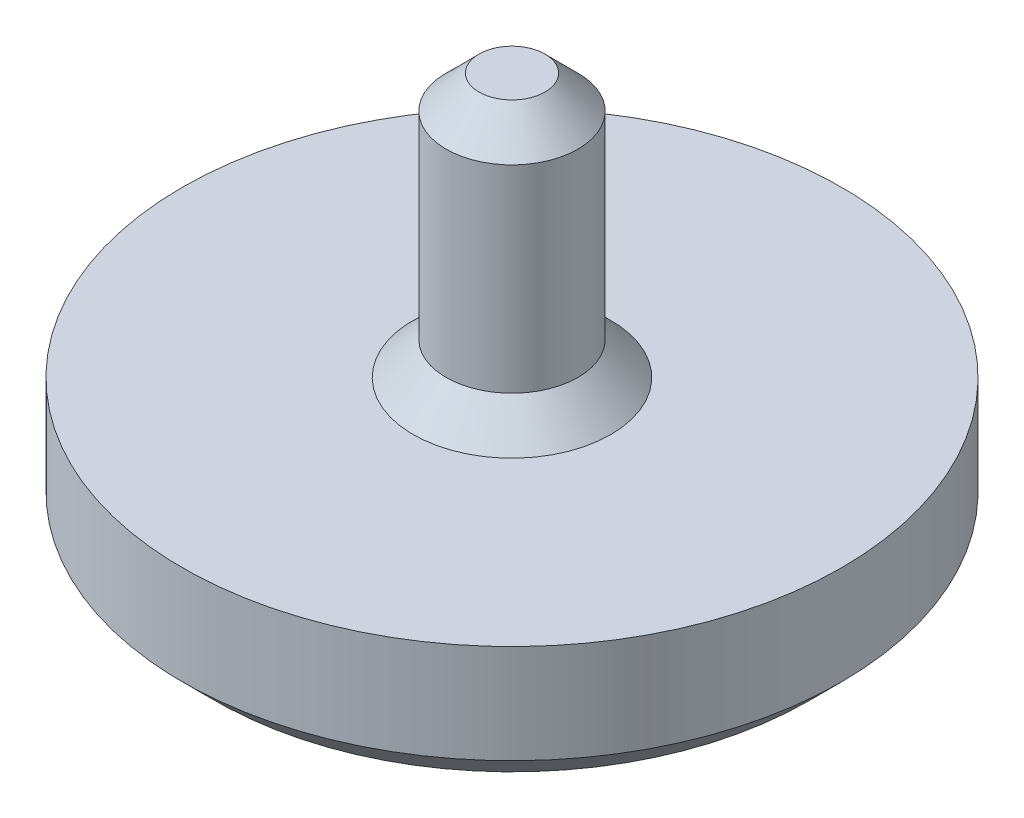
ISO-10303-21;
HEADER;
FILE_DESCRIPTION(('STEP AP214'),'2;1');
FILE_NAME('part.step','',(''),(''),'','','');
FILE_SCHEMA(('AUTOMOTIVE_DESIGN { 1 0 10303 214 1 1 1 1 }'));
ENDSEC;
DATA;
#1=APPLICATION_CONTEXT('core data for automotive mechanical design processes');
#2=APPLICATION_PROTOCOL_DEFINITION('international standard','automotive_design',2000,#1);
#3=PRODUCT_CONTEXT('',#1,'mechanical');
#4=PRODUCT('Part','Part','',(#3));
#5=PRODUCT_RELATED_PRODUCT_CATEGORY('part','',(#4));
#6=PRODUCT_DEFINITION_FORMATION('','',#4);
#7=PRODUCT_DEFINITION_CONTEXT('part definition',#1,'design');
#8=PRODUCT_DEFINITION('design','',#6,#7);
#9=PRODUCT_DEFINITION_SHAPE('','',#8);
#10=(LENGTH_UNIT() NAMED_UNIT(*) SI_UNIT(.MILLI.,.METRE.));
#11=(NAMED_UNIT(*) PLANE_ANGLE_UNIT() SI_UNIT($,.RADIAN.));
#12=(NAMED_UNIT(*) SI_UNIT($,.STERADIAN.) SOLID_ANGLE_UNIT());
#13=UNCERTAINTY_MEASURE_WITH_UNIT(LENGTH_MEASURE(1.E-05),#10,'distance_accuracy_value','');
#14=(GEOMETRIC_REPRESENTATION_CONTEXT(3) GLOBAL_UNCERTAINTY_ASSIGNED_CONTEXT((#13)) GLOBAL_UNIT_ASSIGNED_CONTEXT((#10,
#11,#12)) REPRESENTATION_CONTEXT('',''));
#15=CARTESIAN_POINT('',(0.,0.,0.));
#16=DIRECTION('',(0.,0.,1.));
#17=DIRECTION('',(1.,0.,0.));
#18=AXIS2_PLACEMENT_3D('',#15,#16,#17);
#19=CARTESIAN_POINT('',(0.,4.,0.));
#20=DIRECTION('',(0.,-1.,0.));
#21=DIRECTION('',(1.,0.,0.));
#22=AXIS2_PLACEMENT_3D('',#19,#20,#21);
#23=PLANE('',#22);
#24=CARTESIAN_POINT('',(0.,4.,0.));
#25=DIRECTION('',(0.,-1.,0.));
#26=DIRECTION('',(1.,0.,0.));
#27=AXIS2_PLACEMENT_3D('',#24,#25,#26);
#28=CIRCLE('',#27,0.500000000000002);
#29=CARTESIAN_POINT('',(0.500000000000002,4.,0.));
#30=VERTEX_POINT('',#29);
#31=EDGE_CURVE('E10',#30,#30,#28,.F.);
#32=ORIENTED_EDGE('',*,*,#31,.T.);
#33=EDGE_LOOP('',(#32));
#34=FACE_BOUND('',#33,.T.);
#35=ADVANCED_FACE('F30',(#34),#23,.F.);
#36=CARTESIAN_POINT('',(0.,0.,0.));
#37=DIRECTION('',(0.,-1.,0.));
#38=DIRECTION('',(1.,0.,0.));
#39=AXIS2_PLACEMENT_3D('',#36,#37,#38);
#40=CYLINDRICAL_SURFACE('',#39,1.);
#41=CARTESIAN_POINT('',(0.,0.499999999999996,0.));
#42=DIRECTION('',(0.,-1.,0.));
#43=DIRECTION('',(1.,0.,0.));
#44=AXIS2_PLACEMENT_3D('',#41,#42,#43);
#45=CIRCLE('',#44,1.);
#46=CARTESIAN_POINT('',(1.,0.499999999999996,0.));
#47=VERTEX_POINT('',#46);
#48=EDGE_CURVE('E37',#47,#47,#45,.F.);
#49=ORIENTED_EDGE('',*,*,#48,.T.);
#50=EDGE_LOOP('',(#49));
#51=FACE_BOUND('',#50,.T.);
#52=CARTESIAN_POINT('',(0.,3.5,0.));
#53=DIRECTION('',(0.,-1.,0.));
#54=DIRECTION('',(1.,0.,0.));
#55=AXIS2_PLACEMENT_3D('',#52,#53,#54);
#56=CIRCLE('',#55,1.);
#57=CARTESIAN_POINT('',(1.,3.5,0.));
#58=VERTEX_POINT('',#57);
#59=EDGE_CURVE('E41',#58,#58,#56,.T.);
#60=ORIENTED_EDGE('',*,*,#59,.T.);
#61=EDGE_LOOP('',(#60));
#62=FACE_BOUND('',#61,.T.);
#63=ADVANCED_FACE('F64',(#51,#62),#40,.T.);
#64=CARTESIAN_POINT('',(-1.,0.,0.));
#65=DIRECTION('',(0.,-1.,0.));
#66=DIRECTION('',(1.,0.,0.));
#67=AXIS2_PLACEMENT_3D('',#64,#65,#66);
#68=PLANE('',#67);
#69=CARTESIAN_POINT('',(0.,0.,0.));
#70=DIRECTION('',(0.,-1.,0.));
#71=DIRECTION('',(1.,0.,0.));
#72=AXIS2_PLACEMENT_3D('',#69,#70,#71);
#73=CIRCLE('',#72,1.5);
#74=CARTESIAN_POINT('',(1.5,0.,0.));
#75=VERTEX_POINT('',#74);
#76=EDGE_CURVE('E45',#75,#75,#73,.T.);
#77=ORIENTED_EDGE('',*,*,#76,.T.);
#78=EDGE_LOOP('',(#77));
#79=FACE_BOUND('',#78,.T.);
#80=CARTESIAN_POINT('',(0.,0.,0.));
#81=DIRECTION('',(0.,-1.,0.));
#82=DIRECTION('',(1.,0.,0.));
#83=AXIS2_PLACEMENT_3D('',#80,#81,#82);
#84=CIRCLE('',#83,5.);
#85=CARTESIAN_POINT('',(5.,0.,0.));
#86=VERTEX_POINT('',#85);
#87=EDGE_CURVE('E56',#86,#86,#84,.T.);
#88=ORIENTED_EDGE('',*,*,#87,.F.);
#89=EDGE_LOOP('',(#88));
#90=FACE_BOUND('',#89,.T.);
#91=ADVANCED_FACE('F62',(#79,#90),#68,.F.);
#92=CARTESIAN_POINT('',(0.,0.,0.));
#93=DIRECTION('',(0.,-1.,0.));
#94=DIRECTION('',(1.,0.,0.));
#95=AXIS2_PLACEMENT_3D('',#92,#93,#94);
#96=CYLINDRICAL_SURFACE('',#95,5.);
#97=CARTESIAN_POINT('',(0.,-1.49999999999999,0.));
#98=DIRECTION('',(0.,1.,0.));
#99=DIRECTION('',(-1.,0.,0.));
#100=AXIS2_PLACEMENT_3D('',#97,#98,#99);
#101=CIRCLE('',#100,5.);
#102=CARTESIAN_POINT('',(-5.,-1.49999999999999,0.));
#103=VERTEX_POINT('',#102);
#104=EDGE_CURVE('E50',#103,#103,#101,.T.);
#105=ORIENTED_EDGE('',*,*,#104,.T.);
#106=EDGE_LOOP('',(#105));
#107=FACE_BOUND('',#106,.T.);
#108=ORIENTED_EDGE('',*,*,#87,.T.);
#109=EDGE_LOOP('',(#108));
#110=FACE_BOUND('',#109,.T.);
#111=ADVANCED_FACE('F60',(#107,#110),#96,.T.);
#112=CARTESIAN_POINT('',(-5.,-2.,0.));
#113=DIRECTION('',(0.,1.,0.));
#114=DIRECTION('',(-1.,0.,0.));
#115=AXIS2_PLACEMENT_3D('',#112,#113,#114);
#116=PLANE('',#115);
#117=CARTESIAN_POINT('',(0.,-2.,0.));
#118=DIRECTION('',(0.,1.,0.));
#119=DIRECTION('',(-1.,0.,0.));
#120=AXIS2_PLACEMENT_3D('',#117,#118,#119);
#121=CIRCLE('',#120,4.5);
#122=CARTESIAN_POINT('',(-4.5,-2.,0.));
#123=VERTEX_POINT('',#122);
#124=EDGE_CURVE('E53',#123,#123,#121,.F.);
#125=ORIENTED_EDGE('',*,*,#124,.T.);
#126=EDGE_LOOP('',(#125));
#127=FACE_BOUND('',#126,.T.);
#128=ADVANCED_FACE('F71',(#127),#116,.F.);
#129=CARTESIAN_POINT('',(0.,-2.,0.));
#130=DIRECTION('',(0.,1.,0.));
#131=DIRECTION('',(-1.,0.,0.));
#132=AXIS2_PLACEMENT_3D('',#129,#130,#131);
#133=CONICAL_SURFACE('',#132,4.5,0.785398163397447);
#134=ORIENTED_EDGE('',*,*,#104,.F.);
#135=EDGE_LOOP('',(#134));
#136=FACE_BOUND('',#135,.T.);
#137=ORIENTED_EDGE('',*,*,#124,.F.);
#138=EDGE_LOOP('',(#137));
#139=FACE_BOUND('',#138,.T.);
#140=ADVANCED_FACE('F80',(#136,#139),#133,.T.);
#141=CARTESIAN_POINT('',(0.,0.,0.));
#142=DIRECTION('',(0.,-1.,0.));
#143=DIRECTION('',(1.,0.,0.));
#144=AXIS2_PLACEMENT_3D('',#141,#142,#143);
#145=CONICAL_SURFACE('',#144,1.5,0.785398163397453);
#146=ORIENTED_EDGE('',*,*,#48,.F.);
#147=EDGE_LOOP('',(#146));
#148=FACE_BOUND('',#147,.T.);
#149=ORIENTED_EDGE('',*,*,#76,.F.);
#150=EDGE_LOOP('',(#149));
#151=FACE_BOUND('',#150,.T.);
#152=ADVANCED_FACE('F82',(#148,#151),#145,.T.);
#153=CARTESIAN_POINT('',(0.,3.5,0.));
#154=DIRECTION('',(0.,-1.,0.));
#155=DIRECTION('',(1.,0.,0.));
#156=AXIS2_PLACEMENT_3D('',#153,#154,#155);
#157=CONICAL_SURFACE('',#156,1.,0.78539816339745);
#158=ORIENTED_EDGE('',*,*,#31,.F.);
#159=EDGE_LOOP('',(#158));
#160=FACE_BOUND('',#159,.T.);
#161=ORIENTED_EDGE('',*,*,#59,.F.);
#162=EDGE_LOOP('',(#161));
#163=FACE_BOUND('',#162,.T.);
#164=ADVANCED_FACE('F32',(#160,#163),#157,.T.);
#165=CLOSED_SHELL('',(#35,#63,#91,#111,#128,#140,#152,#164));
#166=MANIFOLD_SOLID_BREP('B2',#165);
#167=ADVANCED_BREP_SHAPE_REPRESENTATION('',(#18,#166),#14);
#168=SHAPE_DEFINITION_REPRESENTATION(#9,#167);
ENDSEC;
END-ISO-10303-21;
